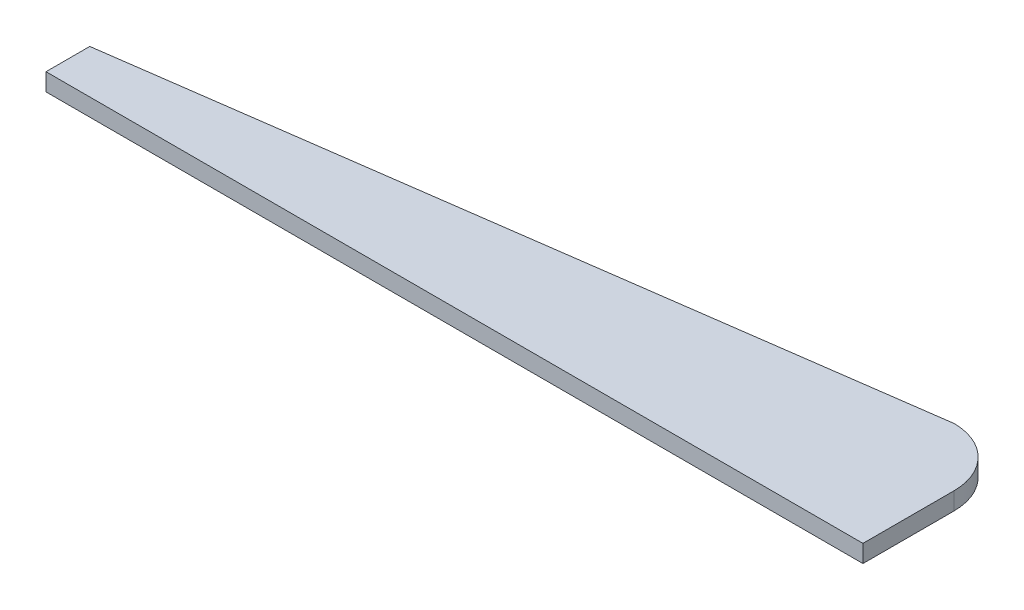
ISO-10303-21;
HEADER;
FILE_DESCRIPTION(('STEP AP214'),'2;1');
FILE_NAME('part.step','',(''),(''),'','','');
FILE_SCHEMA(('AUTOMOTIVE_DESIGN { 1 0 10303 214 1 1 1 1 }'));
ENDSEC;
DATA;
#1=APPLICATION_CONTEXT('core data for automotive mechanical design processes');
#2=APPLICATION_PROTOCOL_DEFINITION('international standard','automotive_design',2000,#1);
#3=PRODUCT_CONTEXT('',#1,'mechanical');
#4=PRODUCT('Part','Part','',(#3));
#5=PRODUCT_RELATED_PRODUCT_CATEGORY('part','',(#4));
#6=PRODUCT_DEFINITION_FORMATION('','',#4);
#7=PRODUCT_DEFINITION_CONTEXT('part definition',#1,'design');
#8=PRODUCT_DEFINITION('design','',#6,#7);
#9=PRODUCT_DEFINITION_SHAPE('','',#8);
#10=(LENGTH_UNIT() NAMED_UNIT(*) SI_UNIT(.MILLI.,.METRE.));
#11=(NAMED_UNIT(*) PLANE_ANGLE_UNIT() SI_UNIT($,.RADIAN.));
#12=(NAMED_UNIT(*) SI_UNIT($,.STERADIAN.) SOLID_ANGLE_UNIT());
#13=UNCERTAINTY_MEASURE_WITH_UNIT(LENGTH_MEASURE(1.E-05),#10,'distance_accuracy_value','');
#14=(GEOMETRIC_REPRESENTATION_CONTEXT(3) GLOBAL_UNCERTAINTY_ASSIGNED_CONTEXT((#13)) GLOBAL_UNIT_ASSIGNED_CONTEXT((#10,
#11,#12)) REPRESENTATION_CONTEXT('',''));
#15=CARTESIAN_POINT('',(0.,0.,0.));
#16=DIRECTION('',(0.,0.,1.));
#17=DIRECTION('',(1.,0.,0.));
#18=AXIS2_PLACEMENT_3D('',#15,#16,#17);
#19=CARTESIAN_POINT('',(39.0375006821521,6.,3.35672776566276));
#20=DIRECTION('',(0.,0.,-1.));
#21=DIRECTION('',(-1.,0.,0.));
#22=AXIS2_PLACEMENT_3D('',#19,#20,#21);
#23=PLANE('',#22);
#24=DIRECTION('',(1.,0.,0.));
#25=VECTOR('',#24,1.);
#26=CARTESIAN_POINT('',(39.0375006821521,0.,3.35672776566276));
#27=LINE('',#26,#25);
#28=CARTESIAN_POINT('',(-240.962499317848,0.,3.35672776566279));
#29=VERTEX_POINT('',#28);
#30=CARTESIAN_POINT('',(39.0375006821521,0.,3.35672776566276));
#31=VERTEX_POINT('',#30);
#32=EDGE_CURVE('E122',#29,#31,#27,.T.);
#33=ORIENTED_EDGE('',*,*,#32,.T.);
#34=DIRECTION('',(0.,-1.,0.));
#35=VECTOR('',#34,1.);
#36=CARTESIAN_POINT('',(39.0375006821521,6.,3.35672776566276));
#37=LINE('',#36,#35);
#38=CARTESIAN_POINT('',(39.0375006821521,6.,3.35672776566276));
#39=VERTEX_POINT('',#38);
#40=EDGE_CURVE('E11',#39,#31,#37,.T.);
#41=ORIENTED_EDGE('',*,*,#40,.F.);
#42=DIRECTION('',(1.,0.,0.));
#43=VECTOR('',#42,1.);
#44=CARTESIAN_POINT('',(39.0375006821521,6.,3.35672776566276));
#45=LINE('',#44,#43);
#46=CARTESIAN_POINT('',(-240.962499317848,6.,3.35672776566279));
#47=VERTEX_POINT('',#46);
#48=EDGE_CURVE('E135',#47,#39,#45,.T.);
#49=ORIENTED_EDGE('',*,*,#48,.F.);
#50=DIRECTION('',(0.,-1.,0.));
#51=VECTOR('',#50,1.);
#52=CARTESIAN_POINT('',(-240.962499317848,6.,3.35672776566279));
#53=LINE('',#52,#51);
#54=EDGE_CURVE('E118',#47,#29,#53,.T.);
#55=ORIENTED_EDGE('',*,*,#54,.T.);
#56=EDGE_LOOP('',(#33,#41,#49,#55));
#57=FACE_BOUND('',#56,.T.);
#58=ADVANCED_FACE('F43',(#57),#23,.F.);
#59=CARTESIAN_POINT('',(39.0375006821521,6.,3.35672776566276));
#60=DIRECTION('',(-1.,0.,0.));
#61=DIRECTION('',(0.,0.,1.));
#62=AXIS2_PLACEMENT_3D('',#59,#60,#61);
#63=PLANE('',#62);
#64=DIRECTION('',(0.,0.,-1.));
#65=VECTOR('',#64,1.);
#66=CARTESIAN_POINT('',(39.0375006821521,0.,3.35672776566276));
#67=LINE('',#66,#65);
#68=CARTESIAN_POINT('',(39.0375006821521,0.,-27.8432722343372));
#69=VERTEX_POINT('',#68);
#70=EDGE_CURVE('E126',#31,#69,#67,.T.);
#71=ORIENTED_EDGE('',*,*,#70,.T.);
#72=DIRECTION('',(0.,-1.,0.));
#73=VECTOR('',#72,1.);
#74=CARTESIAN_POINT('',(39.0375006821521,6.,-27.8432722343372));
#75=LINE('',#74,#73);
#76=CARTESIAN_POINT('',(39.0375006821521,6.,-27.8432722343372));
#77=VERTEX_POINT('',#76);
#78=EDGE_CURVE('E52',#77,#69,#75,.T.);
#79=ORIENTED_EDGE('',*,*,#78,.F.);
#80=DIRECTION('',(0.,0.,-1.));
#81=VECTOR('',#80,1.);
#82=CARTESIAN_POINT('',(39.0375006821521,6.,3.35672776566276));
#83=LINE('',#82,#81);
#84=EDGE_CURVE('E94',#39,#77,#83,.T.);
#85=ORIENTED_EDGE('',*,*,#84,.F.);
#86=ORIENTED_EDGE('',*,*,#40,.T.);
#87=EDGE_LOOP('',(#71,#79,#85,#86));
#88=FACE_BOUND('',#87,.T.);
#89=ADVANCED_FACE('F157',(#88),#63,.F.);
#90=CARTESIAN_POINT('',(19.0375006821521,6.,-27.8432722343372));
#91=DIRECTION('',(0.,-1.,0.));
#92=DIRECTION('',(0.,0.,-1.));
#93=AXIS2_PLACEMENT_3D('',#90,#91,#92);
#94=CYLINDRICAL_SURFACE('',#93,20.);
#95=CARTESIAN_POINT('',(19.0375006821521,0.,-27.8432722343372));
#96=DIRECTION('',(0.,1.,0.));
#97=DIRECTION('',(0.,0.,-1.));
#98=AXIS2_PLACEMENT_3D('',#95,#96,#97);
#99=CIRCLE('',#98,20.);
#100=CARTESIAN_POINT('',(19.0375006821521,0.,-47.8432722343372));
#101=VERTEX_POINT('',#100);
#102=EDGE_CURVE('E110',#69,#101,#99,.T.);
#103=ORIENTED_EDGE('',*,*,#102,.T.);
#104=DIRECTION('',(0.,-1.,0.));
#105=VECTOR('',#104,1.);
#106=CARTESIAN_POINT('',(19.0375006821521,6.,-47.8432722343372));
#107=LINE('',#106,#105);
#108=CARTESIAN_POINT('',(19.0375006821521,6.,-47.8432722343372));
#109=VERTEX_POINT('',#108);
#110=EDGE_CURVE('E107',#109,#101,#107,.T.);
#111=ORIENTED_EDGE('',*,*,#110,.F.);
#112=CARTESIAN_POINT('',(19.0375006821521,6.,-27.8432722343372));
#113=DIRECTION('',(0.,1.,0.));
#114=DIRECTION('',(0.,0.,-1.));
#115=AXIS2_PLACEMENT_3D('',#112,#113,#114);
#116=CIRCLE('',#115,20.);
#117=EDGE_CURVE('E98',#77,#109,#116,.T.);
#118=ORIENTED_EDGE('',*,*,#117,.F.);
#119=ORIENTED_EDGE('',*,*,#78,.T.);
#120=EDGE_LOOP('',(#103,#111,#118,#119));
#121=FACE_BOUND('',#120,.T.);
#122=ADVANCED_FACE('F108',(#121),#94,.T.);
#123=CARTESIAN_POINT('',(-240.962499317848,6.,-11.6432722343372));
#124=DIRECTION('',(0.13790056929087,0.,0.990446077779731));
#125=DIRECTION('',(0.990446077779732,0.,-0.13790056929087));
#126=AXIS2_PLACEMENT_3D('',#123,#124,#125);
#127=PLANE('',#126);
#128=DIRECTION('',(-0.990446077779731,0.,0.13790056929087));
#129=VECTOR('',#128,1.);
#130=CARTESIAN_POINT('',(-240.962499317848,0.,-11.6432722343372));
#131=LINE('',#130,#129);
#132=CARTESIAN_POINT('',(-240.962499317848,0.,-11.6432722343372));
#133=VERTEX_POINT('',#132);
#134=EDGE_CURVE('E80',#101,#133,#131,.T.);
#135=ORIENTED_EDGE('',*,*,#134,.T.);
#136=DIRECTION('',(0.,-1.,0.));
#137=VECTOR('',#136,1.);
#138=CARTESIAN_POINT('',(-240.962499317848,6.,-11.6432722343372));
#139=LINE('',#138,#137);
#140=CARTESIAN_POINT('',(-240.962499317848,6.,-11.6432722343372));
#141=VERTEX_POINT('',#140);
#142=EDGE_CURVE('E112',#141,#133,#139,.T.);
#143=ORIENTED_EDGE('',*,*,#142,.F.);
#144=DIRECTION('',(-0.990446077779731,0.,0.13790056929087));
#145=VECTOR('',#144,1.);
#146=CARTESIAN_POINT('',(-240.962499317848,6.,-11.6432722343372));
#147=LINE('',#146,#145);
#148=EDGE_CURVE('E102',#109,#141,#147,.T.);
#149=ORIENTED_EDGE('',*,*,#148,.F.);
#150=ORIENTED_EDGE('',*,*,#110,.T.);
#151=EDGE_LOOP('',(#135,#143,#149,#150));
#152=FACE_BOUND('',#151,.T.);
#153=ADVANCED_FACE('F114',(#152),#127,.F.);
#154=CARTESIAN_POINT('',(-240.962499317848,6.,3.35672776566279));
#155=DIRECTION('',(1.,0.,0.));
#156=DIRECTION('',(0.,0.,-1.));
#157=AXIS2_PLACEMENT_3D('',#154,#155,#156);
#158=PLANE('',#157);
#159=DIRECTION('',(0.,0.,1.));
#160=VECTOR('',#159,1.);
#161=CARTESIAN_POINT('',(-240.962499317848,0.,3.35672776566279));
#162=LINE('',#161,#160);
#163=EDGE_CURVE('E86',#133,#29,#162,.T.);
#164=ORIENTED_EDGE('',*,*,#163,.T.);
#165=ORIENTED_EDGE('',*,*,#54,.F.);
#166=DIRECTION('',(0.,0.,1.));
#167=VECTOR('',#166,1.);
#168=CARTESIAN_POINT('',(-240.962499317848,6.,3.35672776566279));
#169=LINE('',#168,#167);
#170=EDGE_CURVE('E60',#141,#47,#169,.T.);
#171=ORIENTED_EDGE('',*,*,#170,.F.);
#172=ORIENTED_EDGE('',*,*,#142,.T.);
#173=EDGE_LOOP('',(#164,#165,#171,#172));
#174=FACE_BOUND('',#173,.T.);
#175=ADVANCED_FACE('F146',(#174),#158,.F.);
#176=CARTESIAN_POINT('',(19.0375006821521,6.,-27.8432722343372));
#177=DIRECTION('',(0.,-1.,0.));
#178=DIRECTION('',(0.,0.,-1.));
#179=AXIS2_PLACEMENT_3D('',#176,#177,#178);
#180=PLANE('',#179);
#181=ORIENTED_EDGE('',*,*,#48,.T.);
#182=ORIENTED_EDGE('',*,*,#84,.T.);
#183=ORIENTED_EDGE('',*,*,#117,.T.);
#184=ORIENTED_EDGE('',*,*,#148,.T.);
#185=ORIENTED_EDGE('',*,*,#170,.T.);
#186=EDGE_LOOP('',(#181,#182,#183,#184,#185));
#187=FACE_BOUND('',#186,.T.);
#188=ADVANCED_FACE('F100',(#187),#180,.F.);
#189=CARTESIAN_POINT('',(19.0375006821521,0.,-27.8432722343372));
#190=DIRECTION('',(0.,-1.,0.));
#191=DIRECTION('',(0.,0.,-1.));
#192=AXIS2_PLACEMENT_3D('',#189,#190,#191);
#193=PLANE('',#192);
#194=ORIENTED_EDGE('',*,*,#32,.F.);
#195=ORIENTED_EDGE('',*,*,#163,.F.);
#196=ORIENTED_EDGE('',*,*,#134,.F.);
#197=ORIENTED_EDGE('',*,*,#102,.F.);
#198=ORIENTED_EDGE('',*,*,#70,.F.);
#199=EDGE_LOOP('',(#194,#195,#196,#197,#198));
#200=FACE_BOUND('',#199,.T.);
#201=ADVANCED_FACE('F142',(#200),#193,.T.);
#202=CLOSED_SHELL('',(#58,#89,#122,#153,#175,#188,#201));
#203=MANIFOLD_SOLID_BREP('B2',#202);
#204=ADVANCED_BREP_SHAPE_REPRESENTATION('',(#18,#203),#14);
#205=SHAPE_DEFINITION_REPRESENTATION(#9,#204);
ENDSEC;
END-ISO-10303-21;
